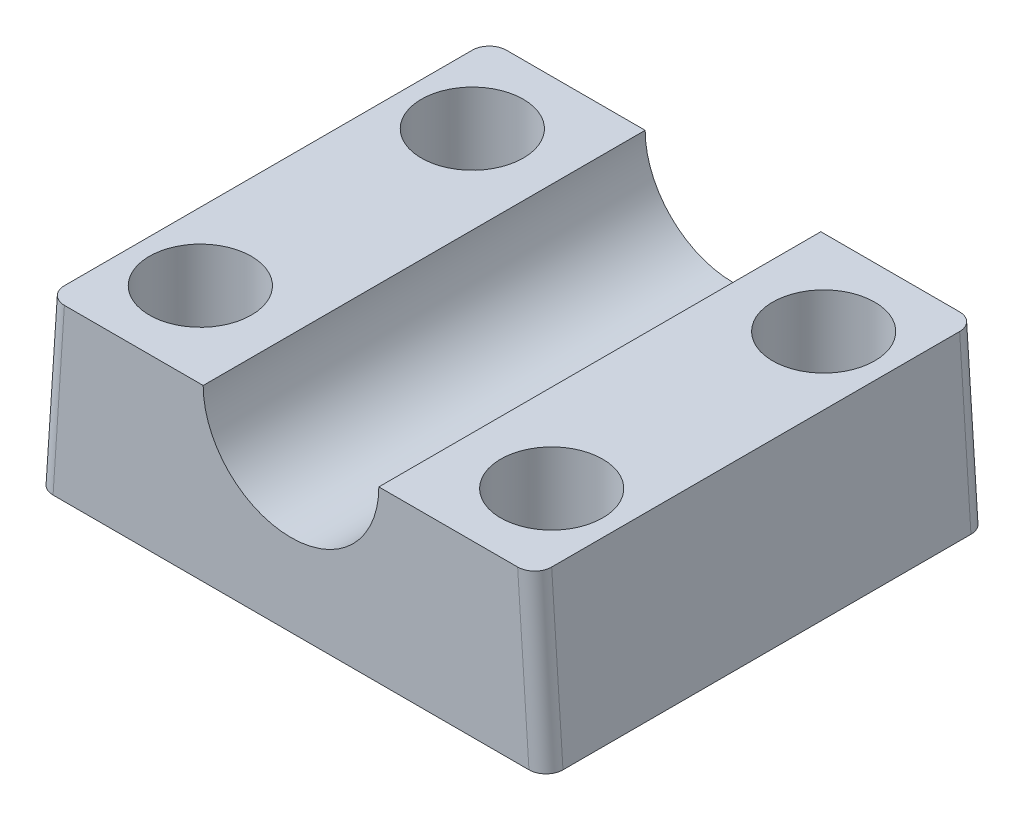
ISO-10303-21;
HEADER;
FILE_DESCRIPTION(('STEP AP214'),'2;1');
FILE_NAME('part.step','',(''),(''),'','','');
FILE_SCHEMA(('AUTOMOTIVE_DESIGN { 1 0 10303 214 1 1 1 1 }'));
ENDSEC;
DATA;
#1=APPLICATION_CONTEXT('core data for automotive mechanical design processes');
#2=APPLICATION_PROTOCOL_DEFINITION('international standard','automotive_design',2000,#1);
#3=PRODUCT_CONTEXT('',#1,'mechanical');
#4=PRODUCT('Part','Part','',(#3));
#5=PRODUCT_RELATED_PRODUCT_CATEGORY('part','',(#4));
#6=PRODUCT_DEFINITION_FORMATION('','',#4);
#7=PRODUCT_DEFINITION_CONTEXT('part definition',#1,'design');
#8=PRODUCT_DEFINITION('design','',#6,#7);
#9=PRODUCT_DEFINITION_SHAPE('','',#8);
#10=(LENGTH_UNIT() NAMED_UNIT(*) SI_UNIT(.MILLI.,.METRE.));
#11=(NAMED_UNIT(*) PLANE_ANGLE_UNIT() SI_UNIT($,.RADIAN.));
#12=(NAMED_UNIT(*) SI_UNIT($,.STERADIAN.) SOLID_ANGLE_UNIT());
#13=UNCERTAINTY_MEASURE_WITH_UNIT(LENGTH_MEASURE(1.E-05),#10,'distance_accuracy_value','');
#14=(GEOMETRIC_REPRESENTATION_CONTEXT(3) GLOBAL_UNCERTAINTY_ASSIGNED_CONTEXT((#13)) GLOBAL_UNIT_ASSIGNED_CONTEXT((#10,
#11,#12)) REPRESENTATION_CONTEXT('',''));
#15=CARTESIAN_POINT('',(0.,0.,0.));
#16=DIRECTION('',(0.,0.,1.));
#17=DIRECTION('',(1.,0.,0.));
#18=AXIS2_PLACEMENT_3D('',#15,#16,#17);
#19=CARTESIAN_POINT('',(0.,15.,39.));
#20=DIRECTION('',(0.,0.,-1.));
#21=DIRECTION('',(-1.,0.,0.));
#22=AXIS2_PLACEMENT_3D('',#19,#20,#21);
#23=CYLINDRICAL_SURFACE('',#22,7.75);
#24=CARTESIAN_POINT('',(0.,15.,0.));
#25=DIRECTION('',(0.,0.,-1.));
#26=DIRECTION('',(1.,0.,0.));
#27=AXIS2_PLACEMENT_3D('',#24,#25,#26);
#28=CIRCLE('',#27,7.75);
#29=CARTESIAN_POINT('',(7.75,15.,0.));
#30=VERTEX_POINT('',#29);
#31=CARTESIAN_POINT('',(-7.75,15.,0.));
#32=VERTEX_POINT('',#31);
#33=EDGE_CURVE('E139',#30,#32,#28,.T.);
#34=ORIENTED_EDGE('',*,*,#33,.T.);
#35=DIRECTION('',(0.,0.,-1.));
#36=VECTOR('',#35,1.);
#37=CARTESIAN_POINT('',(-7.75,15.,39.));
#38=LINE('',#37,#36);
#39=CARTESIAN_POINT('',(-7.75,15.,39.));
#40=VERTEX_POINT('',#39);
#41=EDGE_CURVE('E117',#40,#32,#38,.T.);
#42=ORIENTED_EDGE('',*,*,#41,.F.);
#43=CARTESIAN_POINT('',(0.,15.,39.));
#44=DIRECTION('',(0.,0.,-1.));
#45=DIRECTION('',(1.,0.,0.));
#46=AXIS2_PLACEMENT_3D('',#43,#44,#45);
#47=CIRCLE('',#46,7.75);
#48=CARTESIAN_POINT('',(7.75,15.,39.));
#49=VERTEX_POINT('',#48);
#50=EDGE_CURVE('E125',#49,#40,#47,.T.);
#51=ORIENTED_EDGE('',*,*,#50,.F.);
#52=DIRECTION('',(0.,0.,-1.));
#53=VECTOR('',#52,1.);
#54=CARTESIAN_POINT('',(7.75,15.,39.));
#55=LINE('',#54,#53);
#56=EDGE_CURVE('E206',#49,#30,#55,.T.);
#57=ORIENTED_EDGE('',*,*,#56,.T.);
#58=EDGE_LOOP('',(#34,#42,#51,#57));
#59=FACE_BOUND('',#58,.T.);
#60=ADVANCED_FACE('F37',(#59),#23,.F.);
#61=CARTESIAN_POINT('',(-7.75,15.,39.));
#62=DIRECTION('',(0.,-1.,0.));
#63=DIRECTION('',(1.,0.,0.));
#64=AXIS2_PLACEMENT_3D('',#61,#62,#63);
#65=PLANE('',#64);
#66=CARTESIAN_POINT('',(-15.5,15.,7.5));
#67=DIRECTION('',(0.,-1.,0.));
#68=DIRECTION('',(1.,0.,0.));
#69=AXIS2_PLACEMENT_3D('',#66,#67,#68);
#70=CIRCLE('',#69,4.49999999999999);
#71=CARTESIAN_POINT('',(-11.,15.,7.5));
#72=VERTEX_POINT('',#71);
#73=EDGE_CURVE('E417',#72,#72,#70,.T.);
#74=ORIENTED_EDGE('',*,*,#73,.T.);
#75=EDGE_LOOP('',(#74));
#76=FACE_BOUND('',#75,.T.);
#77=CARTESIAN_POINT('',(-15.5,15.,31.5));
#78=DIRECTION('',(0.,-1.,0.));
#79=DIRECTION('',(1.,0.,0.));
#80=AXIS2_PLACEMENT_3D('',#77,#78,#79);
#81=CIRCLE('',#80,4.49999999999999);
#82=CARTESIAN_POINT('',(-11.,15.,31.5));
#83=VERTEX_POINT('',#82);
#84=EDGE_CURVE('E411',#83,#83,#81,.T.);
#85=ORIENTED_EDGE('',*,*,#84,.T.);
#86=EDGE_LOOP('',(#85));
#87=FACE_BOUND('',#86,.T.);
#88=DIRECTION('',(0.,0.,-1.));
#89=VECTOR('',#88,1.);
#90=CARTESIAN_POINT('',(-21.5,15.,39.));
#91=LINE('',#90,#89);
#92=CARTESIAN_POINT('',(-21.5,15.,37.5));
#93=VERTEX_POINT('',#92);
#94=CARTESIAN_POINT('',(-21.5,15.,1.5));
#95=VERTEX_POINT('',#94);
#96=EDGE_CURVE('E141',#93,#95,#91,.T.);
#97=ORIENTED_EDGE('',*,*,#96,.F.);
#98=CARTESIAN_POINT('',(-19.9966703621627,15.,37.5));
#99=DIRECTION('',(0.,-1.,0.));
#100=DIRECTION('',(1.,0.,0.));
#101=AXIS2_PLACEMENT_3D('',#98,#99,#100);
#102=ELLIPSE('',#101,1.50332963783729,1.5);
#103=CARTESIAN_POINT('',(-19.9966703621627,15.,39.));
#104=VERTEX_POINT('',#103);
#105=EDGE_CURVE('E120',#93,#104,#102,.F.);
#106=ORIENTED_EDGE('',*,*,#105,.T.);
#107=DIRECTION('',(-1.,0.,0.));
#108=VECTOR('',#107,1.);
#109=CARTESIAN_POINT('',(-7.75,15.,39.));
#110=LINE('',#109,#108);
#111=EDGE_CURVE('E113',#40,#104,#110,.T.);
#112=ORIENTED_EDGE('',*,*,#111,.F.);
#113=ORIENTED_EDGE('',*,*,#41,.T.);
#114=DIRECTION('',(-1.,0.,0.));
#115=VECTOR('',#114,1.);
#116=CARTESIAN_POINT('',(-7.75,15.,0.));
#117=LINE('',#116,#115);
#118=CARTESIAN_POINT('',(-19.9966703621627,15.,0.));
#119=VERTEX_POINT('',#118);
#120=EDGE_CURVE('E194',#32,#119,#117,.T.);
#121=ORIENTED_EDGE('',*,*,#120,.T.);
#122=CARTESIAN_POINT('',(-19.9966703621627,15.,1.5));
#123=DIRECTION('',(0.,-1.,0.));
#124=DIRECTION('',(-1.,0.,0.));
#125=AXIS2_PLACEMENT_3D('',#122,#123,#124);
#126=ELLIPSE('',#125,1.50332963783729,1.5);
#127=EDGE_CURVE('E57',#119,#95,#126,.F.);
#128=ORIENTED_EDGE('',*,*,#127,.T.);
#129=EDGE_LOOP('',(#97,#106,#112,#113,#121,#128));
#130=FACE_BOUND('',#129,.T.);
#131=ADVANCED_FACE('F115',(#76,#87,#130),#65,.F.);
#132=CARTESIAN_POINT('',(-21.5,15.,39.));
#133=DIRECTION('',(0.997785157856609,-0.066519010523774,0.));
#134=DIRECTION('',(0.066519010523774,0.997785157856609,0.));
#135=AXIS2_PLACEMENT_3D('',#132,#133,#134);
#136=PLANE('',#135);
#137=DIRECTION('',(0.,0.,-1.));
#138=VECTOR('',#137,1.);
#139=CARTESIAN_POINT('',(-22.5,0.,39.));
#140=LINE('',#139,#138);
#141=CARTESIAN_POINT('',(-22.5,0.,37.5));
#142=VERTEX_POINT('',#141);
#143=CARTESIAN_POINT('',(-22.5,0.,1.5));
#144=VERTEX_POINT('',#143);
#145=EDGE_CURVE('E145',#142,#144,#140,.T.);
#146=ORIENTED_EDGE('',*,*,#145,.F.);
#147=DIRECTION('',(-0.066519010523774,-0.997785157856609,0.));
#148=VECTOR('',#147,1.);
#149=CARTESIAN_POINT('',(-21.5,15.,37.5));
#150=LINE('',#149,#148);
#151=EDGE_CURVE('E179',#142,#93,#150,.F.);
#152=ORIENTED_EDGE('',*,*,#151,.T.);
#153=ORIENTED_EDGE('',*,*,#96,.T.);
#154=DIRECTION('',(-0.066519010523774,-0.997785157856609,0.));
#155=VECTOR('',#154,1.);
#156=CARTESIAN_POINT('',(-21.5,15.,1.5));
#157=LINE('',#156,#155);
#158=EDGE_CURVE('E176',#95,#144,#157,.T.);
#159=ORIENTED_EDGE('',*,*,#158,.T.);
#160=EDGE_LOOP('',(#146,#152,#153,#159));
#161=FACE_BOUND('',#160,.T.);
#162=ADVANCED_FACE('F215',(#161),#136,.F.);
#163=CARTESIAN_POINT('',(-22.5,0.,39.));
#164=DIRECTION('',(0.,1.,0.));
#165=DIRECTION('',(0.,0.,1.));
#166=AXIS2_PLACEMENT_3D('',#163,#164,#165);
#167=PLANE('',#166);
#168=CARTESIAN_POINT('',(15.5,0.,7.5));
#169=DIRECTION('',(0.,-1.,0.));
#170=DIRECTION('',(0.,0.,-1.));
#171=AXIS2_PLACEMENT_3D('',#168,#169,#170);
#172=CIRCLE('',#171,4.49999999999999);
#173=CARTESIAN_POINT('',(15.5,0.,3.00000000000001));
#174=VERTEX_POINT('',#173);
#175=EDGE_CURVE('E156',#174,#174,#172,.T.);
#176=ORIENTED_EDGE('',*,*,#175,.F.);
#177=EDGE_LOOP('',(#176));
#178=FACE_BOUND('',#177,.T.);
#179=CARTESIAN_POINT('',(-15.5,0.,7.5));
#180=DIRECTION('',(0.,-1.,0.));
#181=DIRECTION('',(0.,0.,-1.));
#182=AXIS2_PLACEMENT_3D('',#179,#180,#181);
#183=CIRCLE('',#182,4.49999999999999);
#184=CARTESIAN_POINT('',(-15.5,0.,3.00000000000001));
#185=VERTEX_POINT('',#184);
#186=EDGE_CURVE('E155',#185,#185,#183,.T.);
#187=ORIENTED_EDGE('',*,*,#186,.F.);
#188=EDGE_LOOP('',(#187));
#189=FACE_BOUND('',#188,.T.);
#190=CARTESIAN_POINT('',(-15.5,0.,31.5));
#191=DIRECTION('',(0.,-1.,0.));
#192=DIRECTION('',(0.,0.,-1.));
#193=AXIS2_PLACEMENT_3D('',#190,#191,#192);
#194=CIRCLE('',#193,4.49999999999999);
#195=CARTESIAN_POINT('',(-15.5,0.,27.));
#196=VERTEX_POINT('',#195);
#197=EDGE_CURVE('E408',#196,#196,#194,.T.);
#198=ORIENTED_EDGE('',*,*,#197,.F.);
#199=EDGE_LOOP('',(#198));
#200=FACE_BOUND('',#199,.T.);
#201=CARTESIAN_POINT('',(15.5,0.,31.5));
#202=DIRECTION('',(0.,-1.,0.));
#203=DIRECTION('',(0.,0.,-1.));
#204=AXIS2_PLACEMENT_3D('',#201,#202,#203);
#205=CIRCLE('',#204,4.49999999999999);
#206=CARTESIAN_POINT('',(15.5,0.,27.));
#207=VERTEX_POINT('',#206);
#208=EDGE_CURVE('E152',#207,#207,#205,.T.);
#209=ORIENTED_EDGE('',*,*,#208,.F.);
#210=EDGE_LOOP('',(#209));
#211=FACE_BOUND('',#210,.T.);
#212=DIRECTION('',(0.,0.,-1.));
#213=VECTOR('',#212,1.);
#214=CARTESIAN_POINT('',(22.5,0.,39.));
#215=LINE('',#214,#213);
#216=CARTESIAN_POINT('',(22.5,0.,37.5));
#217=VERTEX_POINT('',#216);
#218=CARTESIAN_POINT('',(22.5,0.,1.5));
#219=VERTEX_POINT('',#218);
#220=EDGE_CURVE('E203',#217,#219,#215,.T.);
#221=ORIENTED_EDGE('',*,*,#220,.F.);
#222=CARTESIAN_POINT('',(20.9966703621627,0.,37.5));
#223=DIRECTION('',(0.,1.,0.));
#224=DIRECTION('',(1.,0.,0.));
#225=AXIS2_PLACEMENT_3D('',#222,#223,#224);
#226=ELLIPSE('',#225,1.50332963783729,1.5);
#227=CARTESIAN_POINT('',(20.9966703621627,0.,39.));
#228=VERTEX_POINT('',#227);
#229=EDGE_CURVE('E174',#217,#228,#226,.F.);
#230=ORIENTED_EDGE('',*,*,#229,.T.);
#231=DIRECTION('',(1.,0.,0.));
#232=VECTOR('',#231,1.);
#233=CARTESIAN_POINT('',(-22.5,0.,39.));
#234=LINE('',#233,#232);
#235=CARTESIAN_POINT('',(-20.9966703621627,0.,39.));
#236=VERTEX_POINT('',#235);
#237=EDGE_CURVE('E124',#236,#228,#234,.T.);
#238=ORIENTED_EDGE('',*,*,#237,.F.);
#239=CARTESIAN_POINT('',(-20.9966703621627,0.,37.5));
#240=DIRECTION('',(0.,1.,0.));
#241=DIRECTION('',(1.,0.,0.));
#242=AXIS2_PLACEMENT_3D('',#239,#240,#241);
#243=ELLIPSE('',#242,1.50332963783729,1.5);
#244=EDGE_CURVE('E172',#236,#142,#243,.F.);
#245=ORIENTED_EDGE('',*,*,#244,.T.);
#246=ORIENTED_EDGE('',*,*,#145,.T.);
#247=CARTESIAN_POINT('',(-20.9966703621627,0.,1.5));
#248=DIRECTION('',(0.,1.,0.));
#249=DIRECTION('',(-1.,0.,0.));
#250=AXIS2_PLACEMENT_3D('',#247,#248,#249);
#251=ELLIPSE('',#250,1.50332963783729,1.5);
#252=CARTESIAN_POINT('',(-20.9966703621627,0.,0.));
#253=VERTEX_POINT('',#252);
#254=EDGE_CURVE('E170',#144,#253,#251,.F.);
#255=ORIENTED_EDGE('',*,*,#254,.T.);
#256=DIRECTION('',(1.,0.,0.));
#257=VECTOR('',#256,1.);
#258=CARTESIAN_POINT('',(-22.5,0.,0.));
#259=LINE('',#258,#257);
#260=CARTESIAN_POINT('',(20.9966703621627,0.,0.));
#261=VERTEX_POINT('',#260);
#262=EDGE_CURVE('E186',#253,#261,#259,.T.);
#263=ORIENTED_EDGE('',*,*,#262,.T.);
#264=CARTESIAN_POINT('',(20.9966703621627,0.,1.5));
#265=DIRECTION('',(0.,1.,0.));
#266=DIRECTION('',(-1.,0.,0.));
#267=AXIS2_PLACEMENT_3D('',#264,#265,#266);
#268=ELLIPSE('',#267,1.50332963783729,1.5);
#269=EDGE_CURVE('E168',#261,#219,#268,.F.);
#270=ORIENTED_EDGE('',*,*,#269,.T.);
#271=EDGE_LOOP('',(#221,#230,#238,#245,#246,#255,#263,#270));
#272=FACE_BOUND('',#271,.T.);
#273=ADVANCED_FACE('F191',(#178,#189,#200,#211,#272),#167,.F.);
#274=CARTESIAN_POINT('',(22.5,0.,39.));
#275=DIRECTION('',(-0.997785157856609,-0.066519010523774,0.));
#276=DIRECTION('',(0.066519010523774,-0.997785157856609,0.));
#277=AXIS2_PLACEMENT_3D('',#274,#275,#276);
#278=PLANE('',#277);
#279=DIRECTION('',(0.,0.,-1.));
#280=VECTOR('',#279,1.);
#281=CARTESIAN_POINT('',(21.5,15.,39.));
#282=LINE('',#281,#280);
#283=CARTESIAN_POINT('',(21.5,15.,37.5));
#284=VERTEX_POINT('',#283);
#285=CARTESIAN_POINT('',(21.5,15.,1.5));
#286=VERTEX_POINT('',#285);
#287=EDGE_CURVE('E201',#284,#286,#282,.T.);
#288=ORIENTED_EDGE('',*,*,#287,.F.);
#289=DIRECTION('',(-0.066519010523774,0.997785157856609,0.));
#290=VECTOR('',#289,1.);
#291=CARTESIAN_POINT('',(22.5,0.,37.5));
#292=LINE('',#291,#290);
#293=EDGE_CURVE('E166',#284,#217,#292,.F.);
#294=ORIENTED_EDGE('',*,*,#293,.T.);
#295=ORIENTED_EDGE('',*,*,#220,.T.);
#296=DIRECTION('',(-0.066519010523774,0.997785157856609,0.));
#297=VECTOR('',#296,1.);
#298=CARTESIAN_POINT('',(22.5,0.,1.5));
#299=LINE('',#298,#297);
#300=EDGE_CURVE('E163',#219,#286,#299,.T.);
#301=ORIENTED_EDGE('',*,*,#300,.T.);
#302=EDGE_LOOP('',(#288,#294,#295,#301));
#303=FACE_BOUND('',#302,.T.);
#304=ADVANCED_FACE('F200',(#303),#278,.F.);
#305=CARTESIAN_POINT('',(21.5,15.,39.));
#306=DIRECTION('',(0.,-1.,0.));
#307=DIRECTION('',(1.,0.,0.));
#308=AXIS2_PLACEMENT_3D('',#305,#306,#307);
#309=PLANE('',#308);
#310=CARTESIAN_POINT('',(15.5,15.,7.5));
#311=DIRECTION('',(0.,-1.,0.));
#312=DIRECTION('',(1.,0.,0.));
#313=AXIS2_PLACEMENT_3D('',#310,#311,#312);
#314=CIRCLE('',#313,4.49999999999999);
#315=CARTESIAN_POINT('',(20.,15.,7.5));
#316=VERTEX_POINT('',#315);
#317=EDGE_CURVE('E153',#316,#316,#314,.T.);
#318=ORIENTED_EDGE('',*,*,#317,.T.);
#319=EDGE_LOOP('',(#318));
#320=FACE_BOUND('',#319,.T.);
#321=CARTESIAN_POINT('',(15.5,15.,31.5));
#322=DIRECTION('',(0.,-1.,0.));
#323=DIRECTION('',(1.,0.,0.));
#324=AXIS2_PLACEMENT_3D('',#321,#322,#323);
#325=CIRCLE('',#324,4.49999999999999);
#326=CARTESIAN_POINT('',(20.,15.,31.5));
#327=VERTEX_POINT('',#326);
#328=EDGE_CURVE('E149',#327,#327,#325,.T.);
#329=ORIENTED_EDGE('',*,*,#328,.T.);
#330=EDGE_LOOP('',(#329));
#331=FACE_BOUND('',#330,.T.);
#332=DIRECTION('',(-1.,0.,0.));
#333=VECTOR('',#332,1.);
#334=CARTESIAN_POINT('',(21.5,15.,39.));
#335=LINE('',#334,#333);
#336=CARTESIAN_POINT('',(19.9966703621627,15.,39.));
#337=VERTEX_POINT('',#336);
#338=EDGE_CURVE('E132',#337,#49,#335,.T.);
#339=ORIENTED_EDGE('',*,*,#338,.F.);
#340=CARTESIAN_POINT('',(19.9966703621627,15.,37.5));
#341=DIRECTION('',(0.,-1.,0.));
#342=DIRECTION('',(1.,0.,0.));
#343=AXIS2_PLACEMENT_3D('',#340,#341,#342);
#344=ELLIPSE('',#343,1.50332963783729,1.5);
#345=EDGE_CURVE('E161',#337,#284,#344,.F.);
#346=ORIENTED_EDGE('',*,*,#345,.T.);
#347=ORIENTED_EDGE('',*,*,#287,.T.);
#348=CARTESIAN_POINT('',(19.9966703621627,15.,1.5));
#349=DIRECTION('',(0.,-1.,0.));
#350=DIRECTION('',(-1.,0.,0.));
#351=AXIS2_PLACEMENT_3D('',#348,#349,#350);
#352=ELLIPSE('',#351,1.50332963783729,1.5);
#353=CARTESIAN_POINT('',(19.9966703621627,15.,0.));
#354=VERTEX_POINT('',#353);
#355=EDGE_CURVE('E159',#286,#354,#352,.F.);
#356=ORIENTED_EDGE('',*,*,#355,.T.);
#357=DIRECTION('',(-1.,0.,0.));
#358=VECTOR('',#357,1.);
#359=CARTESIAN_POINT('',(21.5,15.,0.));
#360=LINE('',#359,#358);
#361=EDGE_CURVE('E136',#354,#30,#360,.T.);
#362=ORIENTED_EDGE('',*,*,#361,.T.);
#363=ORIENTED_EDGE('',*,*,#56,.F.);
#364=EDGE_LOOP('',(#339,#346,#347,#356,#362,#363));
#365=FACE_BOUND('',#364,.T.);
#366=ADVANCED_FACE('F205',(#320,#331,#365),#309,.F.);
#367=CARTESIAN_POINT('',(0.,15.,39.));
#368=DIRECTION('',(0.,0.,1.));
#369=DIRECTION('',(1.,0.,0.));
#370=AXIS2_PLACEMENT_3D('',#367,#368,#369);
#371=PLANE('',#370);
#372=ORIENTED_EDGE('',*,*,#237,.T.);
#373=DIRECTION('',(-0.066519010523774,0.997785157856609,0.));
#374=VECTOR('',#373,1.);
#375=CARTESIAN_POINT('',(20.0033222632151,14.9002214842143,39.));
#376=LINE('',#375,#374);
#377=EDGE_CURVE('E143',#228,#337,#376,.T.);
#378=ORIENTED_EDGE('',*,*,#377,.T.);
#379=ORIENTED_EDGE('',*,*,#338,.T.);
#380=ORIENTED_EDGE('',*,*,#50,.T.);
#381=ORIENTED_EDGE('',*,*,#111,.T.);
#382=DIRECTION('',(-0.066519010523774,-0.997785157856609,0.));
#383=VECTOR('',#382,1.);
#384=CARTESIAN_POINT('',(-21.0033222632151,-0.0997785157856625,39.));
#385=LINE('',#384,#383);
#386=EDGE_CURVE('E140',#104,#236,#385,.T.);
#387=ORIENTED_EDGE('',*,*,#386,.T.);
#388=EDGE_LOOP('',(#372,#378,#379,#380,#381,#387));
#389=FACE_BOUND('',#388,.T.);
#390=ADVANCED_FACE('F129',(#389),#371,.T.);
#391=CARTESIAN_POINT('',(0.,15.,0.));
#392=DIRECTION('',(0.,0.,1.));
#393=DIRECTION('',(1.,0.,0.));
#394=AXIS2_PLACEMENT_3D('',#391,#392,#393);
#395=PLANE('',#394);
#396=ORIENTED_EDGE('',*,*,#262,.F.);
#397=DIRECTION('',(-0.066519010523774,-0.997785157856609,0.));
#398=VECTOR('',#397,1.);
#399=CARTESIAN_POINT('',(-19.9081895198523,16.3272126346568,0.));
#400=LINE('',#399,#398);
#401=EDGE_CURVE('E11',#253,#119,#400,.F.);
#402=ORIENTED_EDGE('',*,*,#401,.T.);
#403=ORIENTED_EDGE('',*,*,#120,.F.);
#404=ORIENTED_EDGE('',*,*,#33,.F.);
#405=ORIENTED_EDGE('',*,*,#361,.F.);
#406=DIRECTION('',(-0.066519010523774,0.997785157856609,0.));
#407=VECTOR('',#406,1.);
#408=CARTESIAN_POINT('',(19.9081895198523,16.3272126346568,0.));
#409=LINE('',#408,#407);
#410=EDGE_CURVE('E45',#354,#261,#409,.F.);
#411=ORIENTED_EDGE('',*,*,#410,.T.);
#412=EDGE_LOOP('',(#396,#402,#403,#404,#405,#411));
#413=FACE_BOUND('',#412,.T.);
#414=ADVANCED_FACE('F185',(#413),#395,.F.);
#415=CARTESIAN_POINT('',(15.5,0.,31.5));
#416=DIRECTION('',(0.,-1.,0.));
#417=DIRECTION('',(0.,0.,-1.));
#418=AXIS2_PLACEMENT_3D('',#415,#416,#417);
#419=CYLINDRICAL_SURFACE('',#418,4.49999999999999);
#420=ORIENTED_EDGE('',*,*,#208,.T.);
#421=EDGE_LOOP('',(#420));
#422=FACE_BOUND('',#421,.T.);
#423=ORIENTED_EDGE('',*,*,#328,.F.);
#424=EDGE_LOOP('',(#423));
#425=FACE_BOUND('',#424,.T.);
#426=ADVANCED_FACE('F263',(#422,#425),#419,.F.);
#427=CARTESIAN_POINT('',(-15.5,0.,31.5));
#428=DIRECTION('',(0.,-1.,0.));
#429=DIRECTION('',(0.,0.,-1.));
#430=AXIS2_PLACEMENT_3D('',#427,#428,#429);
#431=CYLINDRICAL_SURFACE('',#430,4.49999999999999);
#432=ORIENTED_EDGE('',*,*,#197,.T.);
#433=EDGE_LOOP('',(#432));
#434=FACE_BOUND('',#433,.T.);
#435=ORIENTED_EDGE('',*,*,#84,.F.);
#436=EDGE_LOOP('',(#435));
#437=FACE_BOUND('',#436,.T.);
#438=ADVANCED_FACE('F255',(#434,#437),#431,.F.);
#439=CARTESIAN_POINT('',(-15.5,0.,7.5));
#440=DIRECTION('',(0.,-1.,0.));
#441=DIRECTION('',(0.,0.,-1.));
#442=AXIS2_PLACEMENT_3D('',#439,#440,#441);
#443=CYLINDRICAL_SURFACE('',#442,4.49999999999999);
#444=ORIENTED_EDGE('',*,*,#186,.T.);
#445=EDGE_LOOP('',(#444));
#446=FACE_BOUND('',#445,.T.);
#447=ORIENTED_EDGE('',*,*,#73,.F.);
#448=EDGE_LOOP('',(#447));
#449=FACE_BOUND('',#448,.T.);
#450=ADVANCED_FACE('F249',(#446,#449),#443,.F.);
#451=CARTESIAN_POINT('',(15.5,0.,7.5));
#452=DIRECTION('',(0.,-1.,0.));
#453=DIRECTION('',(0.,0.,-1.));
#454=AXIS2_PLACEMENT_3D('',#451,#452,#453);
#455=CYLINDRICAL_SURFACE('',#454,4.49999999999999);
#456=ORIENTED_EDGE('',*,*,#175,.T.);
#457=EDGE_LOOP('',(#456));
#458=FACE_BOUND('',#457,.T.);
#459=ORIENTED_EDGE('',*,*,#317,.F.);
#460=EDGE_LOOP('',(#459));
#461=FACE_BOUND('',#460,.T.);
#462=ADVANCED_FACE('F244',(#458,#461),#455,.F.);
#463=CARTESIAN_POINT('',(19.9081895198523,16.3272126346568,37.5));
#464=DIRECTION('',(0.066519010523774,-0.997785157856609,0.));
#465=DIRECTION('',(0.997785157856609,0.066519010523774,0.));
#466=AXIS2_PLACEMENT_3D('',#463,#464,#465);
#467=CYLINDRICAL_SURFACE('',#466,1.5);
#468=ORIENTED_EDGE('',*,*,#229,.F.);
#469=ORIENTED_EDGE('',*,*,#293,.F.);
#470=ORIENTED_EDGE('',*,*,#345,.F.);
#471=ORIENTED_EDGE('',*,*,#377,.F.);
#472=EDGE_LOOP('',(#468,#469,#470,#471));
#473=FACE_BOUND('',#472,.T.);
#474=ADVANCED_FACE('F232',(#473),#467,.T.);
#475=CARTESIAN_POINT('',(-19.9081895198523,16.3272126346568,37.5));
#476=DIRECTION('',(0.066519010523774,0.997785157856609,0.));
#477=DIRECTION('',(-0.997785157856609,0.066519010523774,0.));
#478=AXIS2_PLACEMENT_3D('',#475,#476,#477);
#479=CYLINDRICAL_SURFACE('',#478,1.5);
#480=ORIENTED_EDGE('',*,*,#105,.F.);
#481=ORIENTED_EDGE('',*,*,#151,.F.);
#482=ORIENTED_EDGE('',*,*,#244,.F.);
#483=ORIENTED_EDGE('',*,*,#386,.F.);
#484=EDGE_LOOP('',(#480,#481,#482,#483));
#485=FACE_BOUND('',#484,.T.);
#486=ADVANCED_FACE('F218',(#485),#479,.T.);
#487=CARTESIAN_POINT('',(-20.0033222632151,14.9002214842143,1.5));
#488=DIRECTION('',(-0.066519010523774,-0.997785157856609,0.));
#489=DIRECTION('',(0.997785157856609,-0.066519010523774,0.));
#490=AXIS2_PLACEMENT_3D('',#487,#488,#489);
#491=CYLINDRICAL_SURFACE('',#490,1.5);
#492=ORIENTED_EDGE('',*,*,#127,.F.);
#493=ORIENTED_EDGE('',*,*,#401,.F.);
#494=ORIENTED_EDGE('',*,*,#254,.F.);
#495=ORIENTED_EDGE('',*,*,#158,.F.);
#496=EDGE_LOOP('',(#492,#493,#494,#495));
#497=FACE_BOUND('',#496,.T.);
#498=ADVANCED_FACE('F226',(#497),#491,.T.);
#499=CARTESIAN_POINT('',(21.0033222632151,-0.099778515785661,1.5));
#500=DIRECTION('',(-0.066519010523774,0.997785157856609,0.));
#501=DIRECTION('',(-0.997785157856609,-0.066519010523774,0.));
#502=AXIS2_PLACEMENT_3D('',#499,#500,#501);
#503=CYLINDRICAL_SURFACE('',#502,1.5);
#504=ORIENTED_EDGE('',*,*,#269,.F.);
#505=ORIENTED_EDGE('',*,*,#410,.F.);
#506=ORIENTED_EDGE('',*,*,#355,.F.);
#507=ORIENTED_EDGE('',*,*,#300,.F.);
#508=EDGE_LOOP('',(#504,#505,#506,#507));
#509=FACE_BOUND('',#508,.T.);
#510=ADVANCED_FACE('F39',(#509),#503,.T.);
#511=CLOSED_SHELL('',(#60,#131,#162,#273,#304,#366,#390,#414,#426,#438,#450,#462,#474,#486,#498,#510));
#512=MANIFOLD_SOLID_BREP('B2',#511);
#513=ADVANCED_BREP_SHAPE_REPRESENTATION('',(#18,#512),#14);
#514=SHAPE_DEFINITION_REPRESENTATION(#9,#513);
ENDSEC;
END-ISO-10303-21;
